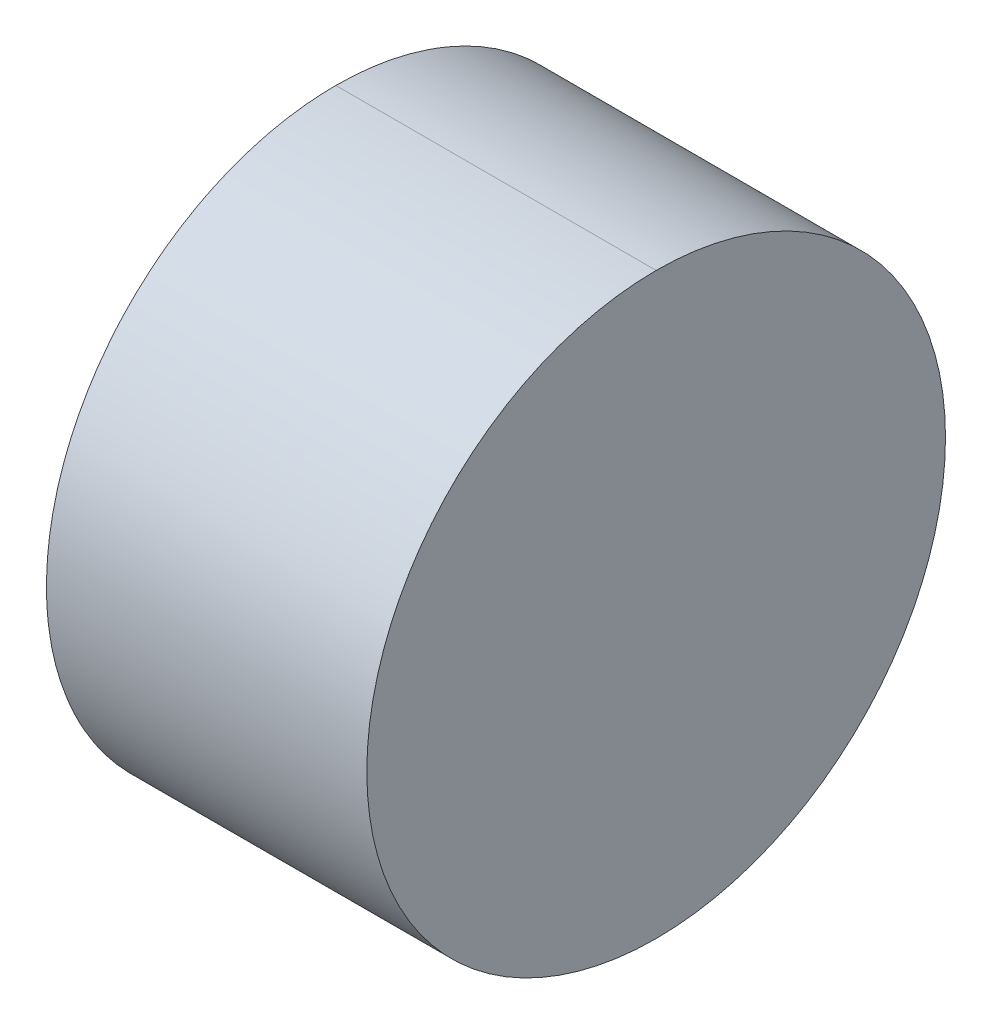
ISO-10303-21;
HEADER;
FILE_DESCRIPTION(('STEP AP214'),'2;1');
FILE_NAME('part.step','',(''),(''),'','','');
FILE_SCHEMA(('AUTOMOTIVE_DESIGN { 1 0 10303 214 1 1 1 1 }'));
ENDSEC;
DATA;
#1=APPLICATION_CONTEXT('core data for automotive mechanical design processes');
#2=APPLICATION_PROTOCOL_DEFINITION('international standard','automotive_design',2000,#1);
#3=PRODUCT_CONTEXT('',#1,'mechanical');
#4=PRODUCT('Part','Part','',(#3));
#5=PRODUCT_RELATED_PRODUCT_CATEGORY('part','',(#4));
#6=PRODUCT_DEFINITION_FORMATION('','',#4);
#7=PRODUCT_DEFINITION_CONTEXT('part definition',#1,'design');
#8=PRODUCT_DEFINITION('design','',#6,#7);
#9=PRODUCT_DEFINITION_SHAPE('','',#8);
#10=(LENGTH_UNIT() NAMED_UNIT(*) SI_UNIT(.MILLI.,.METRE.));
#11=(NAMED_UNIT(*) PLANE_ANGLE_UNIT() SI_UNIT($,.RADIAN.));
#12=(NAMED_UNIT(*) SI_UNIT($,.STERADIAN.) SOLID_ANGLE_UNIT());
#13=UNCERTAINTY_MEASURE_WITH_UNIT(LENGTH_MEASURE(1.E-05),#10,'distance_accuracy_value','');
#14=(GEOMETRIC_REPRESENTATION_CONTEXT(3) GLOBAL_UNCERTAINTY_ASSIGNED_CONTEXT((#13)) GLOBAL_UNIT_ASSIGNED_CONTEXT((#10,
#11,#12)) REPRESENTATION_CONTEXT('',''));
#15=CARTESIAN_POINT('',(0.,0.,0.));
#16=DIRECTION('',(0.,0.,1.));
#17=DIRECTION('',(1.,0.,0.));
#18=AXIS2_PLACEMENT_3D('',#15,#16,#17);
#19=CARTESIAN_POINT('',(149.23796213291,48.172882502233,6.251144359575));
#20=DIRECTION('',(-1.,-4.37113882867399E-08,4.37114091299599E-08));
#21=DIRECTION('',(-4.371138828674E-08,1.,0.));
#22=AXIS2_PLACEMENT_3D('',#19,#20,#21);
#23=PLANE('',#22);
#24=CARTESIAN_POINT('',(149.23796213291,48.172882502233,6.251144359575));
#25=DIRECTION('',(-1.,-4.37113882867399E-08,4.37114091299599E-08));
#26=DIRECTION('',(-4.37114021394238E-08,0.999999999999999,0.));
#27=AXIS2_PLACEMENT_3D('',#24,#25,#26);
#28=CIRCLE('',#27,0.711200000000003);
#29=CARTESIAN_POINT('',(149.237962101822,48.884082502233,6.251144359575));
#30=VERTEX_POINT('',#29);
#31=CARTESIAN_POINT('',(149.237962163995,47.461682502233,6.251144359575));
#32=VERTEX_POINT('',#31);
#33=EDGE_CURVE('E48',#30,#32,#28,.T.);
#34=ORIENTED_EDGE('',*,*,#33,.F.);
#35=CARTESIAN_POINT('',(149.23796213291,48.172882502233,6.251144359575));
#36=DIRECTION('',(-1.,-4.37113882867399E-08,4.37114091299599E-08));
#37=DIRECTION('',(4.37114021394238E-08,-0.999999999999999,0.));
#38=AXIS2_PLACEMENT_3D('',#35,#36,#37);
#39=CIRCLE('',#38,0.711200000000003);
#40=EDGE_CURVE('E43',#32,#30,#39,.T.);
#41=ORIENTED_EDGE('',*,*,#40,.F.);
#42=EDGE_LOOP('',(#34,#41));
#43=FACE_BOUND('',#42,.T.);
#44=ADVANCED_FACE('F16',(#43),#23,.F.);
#45=CARTESIAN_POINT('',(149.23796213291,48.172882502233,6.251144359575));
#46=DIRECTION('',(-1.,-4.37113882867399E-08,4.37114091299599E-08));
#47=DIRECTION('',(4.371138828674E-08,-1.,0.));
#48=AXIS2_PLACEMENT_3D('',#45,#46,#47);
#49=CYLINDRICAL_SURFACE('',#48,0.7112);
#50=CARTESIAN_POINT('',(148.450562163998,47.461682467815,6.251144393993));
#51=CARTESIAN_POINT('',(148.450562170169,47.461682467815,6.39232445418948));
#52=CARTESIAN_POINT('',(148.450562173528,47.515819344293,6.52330885109105));
#53=CARTESIAN_POINT('',(148.450562176868,47.5696450315048,6.65354032427418));
#54=CARTESIAN_POINT('',(148.450562176874,47.6699881250351,6.75403873677288));
#55=CARTESIAN_POINT('',(148.450562176881,47.7695540029337,6.85375873060409));
#56=CARTESIAN_POINT('',(148.450562173528,47.9007180107169,6.90820751751503));
#57=CARTESIAN_POINT('',(148.4505621702,48.0308660769587,6.96223456689721));
#58=CARTESIAN_POINT('',(148.450562163998,48.172882467815,6.962344393993));
#59=CARTESIAN_POINT('',(148.450562157843,48.31379885911,6.96245337041405));
#60=CARTESIAN_POINT('',(148.450562149734,48.4450469249131,6.90820751751503));
#61=CARTESIAN_POINT('',(148.450562141689,48.5752783980968,6.85438183030262));
#62=CARTESIAN_POINT('',(148.45056213291,48.6757768105949,6.75403873677288));
#63=CARTESIAN_POINT('',(148.450562124199,48.7754968044261,6.6544728588742));
#64=CARTESIAN_POINT('',(148.450562116086,48.829945591337,6.52330885109105));
#65=CARTESIAN_POINT('',(148.450562108019,48.884082467815,6.39289621766863));
#66=CARTESIAN_POINT('',(148.450562101822,48.884082467815,6.251144393993));
#67=B_SPLINE_CURVE_WITH_KNOTS('',2,(#50,#51,#52,#53,#54,#55,#56,#57,#58,#59,#60,#61,#62,#63,#64,
#65,#66),.UNSPECIFIED.,.F.,.F.,(3,2,2,2,2,2,2,2,3),(0.,0.125,0.25,0.375,0.5,0.625,0.75,0.875,
1.),.UNSPECIFIED.);
#68=CARTESIAN_POINT('',(148.450562163995,47.4616824678148,6.25114439399324));
#69=VERTEX_POINT('',#68);
#70=CARTESIAN_POINT('',(148.450562101822,48.8840824678148,6.25114439399312));
#71=VERTEX_POINT('',#70);
#72=EDGE_CURVE('E28',#69,#71,#67,.T.);
#73=ORIENTED_EDGE('',*,*,#72,.F.);
#74=CARTESIAN_POINT('',(149.23796216399,47.461682502233,6.251144359575));
#75=DIRECTION('',(-0.999999999999998,-4.37113832556823E-08,4.3711409692921E-08));
#76=VECTOR('',#75,1.);
#77=LINE('',#74,#76);
#78=EDGE_CURVE('E53',#32,#69,#77,.T.);
#79=ORIENTED_EDGE('',*,*,#78,.F.);
#80=ORIENTED_EDGE('',*,*,#40,.T.);
#81=CARTESIAN_POINT('',(148.45056210182,48.8840824678147,6.25114439399336));
#82=DIRECTION('',(0.999999999999998,4.37113920680952E-08,-4.3711409692921E-08));
#83=VECTOR('',#82,1.);
#84=LINE('',#81,#83);
#85=EDGE_CURVE('E36',#71,#30,#84,.T.);
#86=ORIENTED_EDGE('',*,*,#85,.F.);
#87=EDGE_LOOP('',(#73,#79,#80,#86));
#88=FACE_BOUND('',#87,.T.);
#89=ADVANCED_FACE('F55',(#88),#49,.T.);
#90=CARTESIAN_POINT('',(149.23796213291,48.172882502233,6.251144359575));
#91=DIRECTION('',(-1.,-4.37113882867399E-08,4.37114091299599E-08));
#92=DIRECTION('',(4.371138828674E-08,-1.,0.));
#93=AXIS2_PLACEMENT_3D('',#90,#91,#92);
#94=CYLINDRICAL_SURFACE('',#93,0.7112);
#95=ORIENTED_EDGE('',*,*,#78,.T.);
#96=CARTESIAN_POINT('',(148.450562101822,48.884082467815,6.251144393993));
#97=CARTESIAN_POINT('',(148.450562095651,48.884082467815,6.10996433379652));
#98=CARTESIAN_POINT('',(148.450562092292,48.829945591337,5.97897993689495));
#99=CARTESIAN_POINT('',(148.450562088952,48.7761199041252,5.84874846371182));
#100=CARTESIAN_POINT('',(148.450562088946,48.6757768105949,5.74825005121313));
#101=CARTESIAN_POINT('',(148.450562088939,48.5762109326961,5.64853005738173));
#102=CARTESIAN_POINT('',(148.450562092292,48.4450469249131,5.59408127047097));
#103=CARTESIAN_POINT('',(148.45056209562,48.314898858671,5.5400542210888));
#104=CARTESIAN_POINT('',(148.450562101822,48.172882467815,5.539944393993));
#105=CARTESIAN_POINT('',(148.450562107977,48.0319660765198,5.53983541757195));
#106=CARTESIAN_POINT('',(148.450562116086,47.9007180107169,5.59408127047097));
#107=CARTESIAN_POINT('',(148.450562124131,47.770486537533,5.64790695768357));
#108=CARTESIAN_POINT('',(148.45056213291,47.6699881250351,5.74825005121313));
#109=CARTESIAN_POINT('',(148.450562141621,47.570268131204,5.84781592911172));
#110=CARTESIAN_POINT('',(148.450562149734,47.515819344293,5.97897993689495));
#111=CARTESIAN_POINT('',(148.450562157801,47.461682467815,6.10939257031726));
#112=CARTESIAN_POINT('',(148.450562163998,47.461682467815,6.251144393993));
#113=B_SPLINE_CURVE_WITH_KNOTS('',2,(#96,#97,#98,#99,#100,#101,#102,#103,#104,#105,#106,#107,
#108,#109,#110,#111,#112),.UNSPECIFIED.,.F.,.F.,(3,2,2,2,2,2,2,2,3),(0.,0.125,0.25,0.375,0.5,
0.625,0.75,0.875,1.),.UNSPECIFIED.);
#114=EDGE_CURVE('E11',#71,#69,#113,.T.);
#115=ORIENTED_EDGE('',*,*,#114,.F.);
#116=ORIENTED_EDGE('',*,*,#85,.T.);
#117=ORIENTED_EDGE('',*,*,#33,.T.);
#118=EDGE_LOOP('',(#95,#115,#116,#117));
#119=FACE_BOUND('',#118,.T.);
#120=ADVANCED_FACE('F64',(#119),#94,.T.);
#121=CARTESIAN_POINT('',(148.45056213291,48.172882467815,6.251144393993));
#122=DIRECTION('',(-1.,-4.37113882867399E-08,4.37114091299599E-08));
#123=DIRECTION('',(-4.371138828674E-08,1.,0.));
#124=AXIS2_PLACEMENT_3D('',#121,#122,#123);
#125=PLANE('',#124);
#126=ORIENTED_EDGE('',*,*,#72,.T.);
#127=ORIENTED_EDGE('',*,*,#114,.T.);
#128=EDGE_LOOP('',(#126,#127));
#129=FACE_BOUND('',#128,.T.);
#130=ADVANCED_FACE('F83',(#129),#125,.T.);
#131=CLOSED_SHELL('',(#44,#89,#120,#130));
#132=MANIFOLD_SOLID_BREP('B1',#131);
#133=ADVANCED_BREP_SHAPE_REPRESENTATION('',(#18,#132),#14);
#134=SHAPE_DEFINITION_REPRESENTATION(#9,#133);
ENDSEC;
END-ISO-10303-21;
